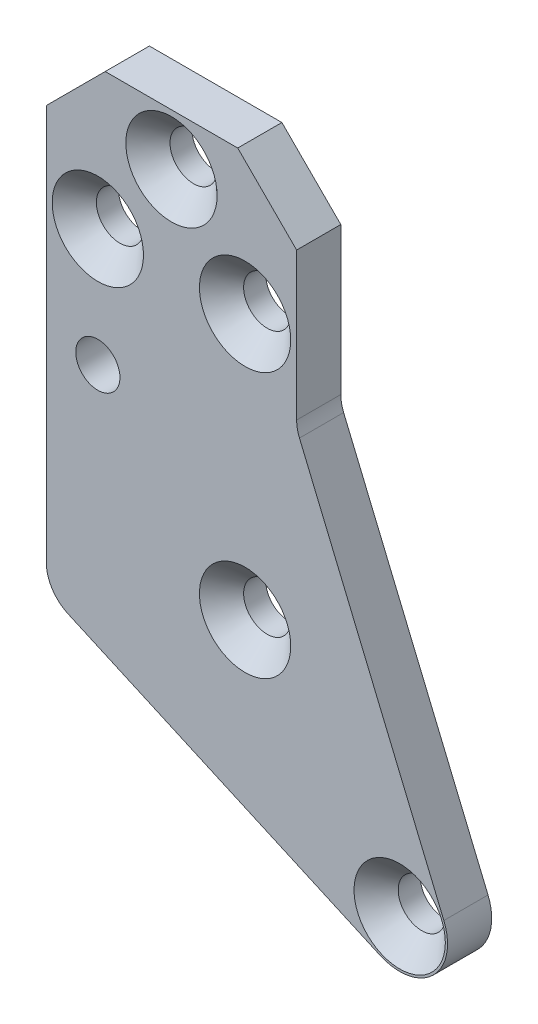
ISO-10303-21;
HEADER;
FILE_DESCRIPTION(('STEP AP214'),'2;1');
FILE_NAME('part.step','',(''),(''),'','','');
FILE_SCHEMA(('AUTOMOTIVE_DESIGN { 1 0 10303 214 1 1 1 1 }'));
ENDSEC;
DATA;
#1=APPLICATION_CONTEXT('core data for automotive mechanical design processes');
#2=APPLICATION_PROTOCOL_DEFINITION('international standard','automotive_design',2000,#1);
#3=PRODUCT_CONTEXT('',#1,'mechanical');
#4=PRODUCT('Part','Part','',(#3));
#5=PRODUCT_RELATED_PRODUCT_CATEGORY('part','',(#4));
#6=PRODUCT_DEFINITION_FORMATION('','',#4);
#7=PRODUCT_DEFINITION_CONTEXT('part definition',#1,'design');
#8=PRODUCT_DEFINITION('design','',#6,#7);
#9=PRODUCT_DEFINITION_SHAPE('','',#8);
#10=(LENGTH_UNIT() NAMED_UNIT(*) SI_UNIT(.MILLI.,.METRE.));
#11=(NAMED_UNIT(*) PLANE_ANGLE_UNIT() SI_UNIT($,.RADIAN.));
#12=(NAMED_UNIT(*) SI_UNIT($,.STERADIAN.) SOLID_ANGLE_UNIT());
#13=UNCERTAINTY_MEASURE_WITH_UNIT(LENGTH_MEASURE(1.E-05),#10,'distance_accuracy_value','');
#14=(GEOMETRIC_REPRESENTATION_CONTEXT(3) GLOBAL_UNCERTAINTY_ASSIGNED_CONTEXT((#13)) GLOBAL_UNIT_ASSIGNED_CONTEXT((#10,
#11,#12)) REPRESENTATION_CONTEXT('',''));
#15=CARTESIAN_POINT('',(0.,0.,0.));
#16=DIRECTION('',(0.,0.,1.));
#17=DIRECTION('',(1.,0.,0.));
#18=AXIS2_PLACEMENT_3D('',#15,#16,#17);
#19=CARTESIAN_POINT('',(20.5,-22.1865334794732,1.5));
#20=DIRECTION('',(0.,0.,1.));
#21=DIRECTION('',(1.,0.,0.));
#22=AXIS2_PLACEMENT_3D('',#19,#20,#21);
#23=PLANE('',#22);
#24=CARTESIAN_POINT('',(20.5,-22.1865334794732,1.5));
#25=DIRECTION('',(0.,0.,1.));
#26=DIRECTION('',(1.,0.,0.));
#27=AXIS2_PLACEMENT_3D('',#24,#25,#26);
#28=CIRCLE('',#27,3.10000000000002);
#29=CARTESIAN_POINT('',(23.6000000000001,-22.1865334794732,1.5));
#30=VERTEX_POINT('',#29);
#31=EDGE_CURVE('E181',#30,#30,#28,.F.);
#32=ORIENTED_EDGE('',*,*,#31,.T.);
#33=EDGE_LOOP('',(#32));
#34=FACE_BOUND('',#33,.T.);
#35=CARTESIAN_POINT('',(10.,-10.,1.5));
#36=DIRECTION('',(0.,0.,1.));
#37=DIRECTION('',(1.,0.,0.));
#38=AXIS2_PLACEMENT_3D('',#35,#36,#37);
#39=CIRCLE('',#38,3.10000000000002);
#40=CARTESIAN_POINT('',(13.1,-10.,1.5));
#41=VERTEX_POINT('',#40);
#42=EDGE_CURVE('E178',#41,#41,#39,.F.);
#43=ORIENTED_EDGE('',*,*,#42,.T.);
#44=EDGE_LOOP('',(#43));
#45=FACE_BOUND('',#44,.T.);
#46=CARTESIAN_POINT('',(10.,8.,1.5));
#47=DIRECTION('',(0.,0.,1.));
#48=DIRECTION('',(1.,0.,0.));
#49=AXIS2_PLACEMENT_3D('',#46,#47,#48);
#50=CIRCLE('',#49,3.10000000000002);
#51=CARTESIAN_POINT('',(13.1,8.,1.5));
#52=VERTEX_POINT('',#51);
#53=EDGE_CURVE('E175',#52,#52,#50,.F.);
#54=ORIENTED_EDGE('',*,*,#53,.T.);
#55=EDGE_LOOP('',(#54));
#56=FACE_BOUND('',#55,.T.);
#57=CARTESIAN_POINT('',(5.,14.,1.5));
#58=DIRECTION('',(0.,0.,1.));
#59=DIRECTION('',(1.,0.,0.));
#60=AXIS2_PLACEMENT_3D('',#57,#58,#59);
#61=CIRCLE('',#60,3.1);
#62=CARTESIAN_POINT('',(8.1,14.,1.5));
#63=VERTEX_POINT('',#62);
#64=EDGE_CURVE('E172',#63,#63,#61,.F.);
#65=ORIENTED_EDGE('',*,*,#64,.T.);
#66=EDGE_LOOP('',(#65));
#67=FACE_BOUND('',#66,.T.);
#68=CARTESIAN_POINT('',(0.,8.,1.5));
#69=DIRECTION('',(0.,0.,1.));
#70=DIRECTION('',(1.,0.,0.));
#71=AXIS2_PLACEMENT_3D('',#68,#69,#70);
#72=CIRCLE('',#71,3.10000000000002);
#73=CARTESIAN_POINT('',(3.10000000000002,8.,1.5));
#74=VERTEX_POINT('',#73);
#75=EDGE_CURVE('E169',#74,#74,#72,.F.);
#76=ORIENTED_EDGE('',*,*,#75,.T.);
#77=EDGE_LOOP('',(#76));
#78=FACE_BOUND('',#77,.T.);
#79=CARTESIAN_POINT('',(0.,0.,1.5));
#80=DIRECTION('',(0.,0.,1.));
#81=DIRECTION('',(1.,0.,0.));
#82=AXIS2_PLACEMENT_3D('',#79,#80,#81);
#83=CIRCLE('',#82,1.5);
#84=CARTESIAN_POINT('',(1.5,0.,1.5));
#85=VERTEX_POINT('',#84);
#86=EDGE_CURVE('E155',#85,#85,#83,.T.);
#87=ORIENTED_EDGE('',*,*,#86,.F.);
#88=EDGE_LOOP('',(#87));
#89=FACE_BOUND('',#88,.T.);
#90=DIRECTION('',(0.,1.,0.));
#91=VECTOR('',#90,1.);
#92=CARTESIAN_POINT('',(13.5,17.5,1.5));
#93=LINE('',#92,#91);
#94=CARTESIAN_POINT('',(13.5,3.50122345330613,1.5));
#95=VERTEX_POINT('',#94);
#96=CARTESIAN_POINT('',(13.5,13.5,1.5));
#97=VERTEX_POINT('',#96);
#98=EDGE_CURVE('E146',#95,#97,#93,.T.);
#99=ORIENTED_EDGE('',*,*,#98,.T.);
#100=DIRECTION('',(0.707106781186546,-0.707106781186549,0.));
#101=VECTOR('',#100,1.);
#102=CARTESIAN_POINT('',(34.8432667397366,-7.84326673973672,1.5));
#103=LINE('',#102,#101);
#104=CARTESIAN_POINT('',(9.49999999999999,17.5,1.5));
#105=VERTEX_POINT('',#104);
#106=EDGE_CURVE('E48',#97,#105,#103,.F.);
#107=ORIENTED_EDGE('',*,*,#106,.T.);
#108=DIRECTION('',(-1.,0.,0.));
#109=VECTOR('',#108,1.);
#110=CARTESIAN_POINT('',(-3.5,17.5,1.5));
#111=LINE('',#110,#109);
#112=CARTESIAN_POINT('',(0.500000000000015,17.5,1.5));
#113=VERTEX_POINT('',#112);
#114=EDGE_CURVE('E165',#105,#113,#111,.T.);
#115=ORIENTED_EDGE('',*,*,#114,.T.);
#116=DIRECTION('',(0.707106781186549,0.707106781186546,0.));
#117=VECTOR('',#116,1.);
#118=CARTESIAN_POINT('',(-9.34326673973654,7.65673326026348,1.5));
#119=LINE('',#118,#117);
#120=CARTESIAN_POINT('',(-3.5,13.5,1.5));
#121=VERTEX_POINT('',#120);
#122=EDGE_CURVE('E55',#113,#121,#119,.F.);
#123=ORIENTED_EDGE('',*,*,#122,.T.);
#124=DIRECTION('',(0.,-1.,0.));
#125=VECTOR('',#124,1.);
#126=CARTESIAN_POINT('',(-3.5,17.5,1.5));
#127=LINE('',#126,#125);
#128=CARTESIAN_POINT('',(-3.5,-13.3803085087297,1.5));
#129=VERTEX_POINT('',#128);
#130=EDGE_CURVE('E129',#121,#129,#127,.T.);
#131=ORIENTED_EDGE('',*,*,#130,.T.);
#132=CARTESIAN_POINT('',(-0.999999999999999,-13.3803085087297,1.5));
#133=DIRECTION('',(0.,0.,1.));
#134=DIRECTION('',(1.,0.,0.));
#135=AXIS2_PLACEMENT_3D('',#132,#133,#134);
#136=CIRCLE('',#135,2.5);
#137=CARTESIAN_POINT('',(-2.02176146059093,-15.6619753375308,1.5));
#138=VERTEX_POINT('',#137);
#139=EDGE_CURVE('E125',#129,#138,#136,.T.);
#140=ORIENTED_EDGE('',*,*,#139,.T.);
#141=DIRECTION('',(0.912666731520425,-0.408704584236371,0.));
#142=VECTOR('',#141,1.);
#143=CARTESIAN_POINT('',(-3.5,-15.,1.5));
#144=LINE('',#143,#142);
#145=CARTESIAN_POINT('',(19.1717101012318,-25.1527003569146,1.5));
#146=VERTEX_POINT('',#145);
#147=EDGE_CURVE('E118',#138,#146,#144,.T.);
#148=ORIENTED_EDGE('',*,*,#147,.T.);
#149=CARTESIAN_POINT('',(20.5,-22.1865334794732,1.5));
#150=DIRECTION('',(0.,0.,1.));
#151=DIRECTION('',(1.,0.,0.));
#152=AXIS2_PLACEMENT_3D('',#149,#150,#151);
#153=CIRCLE('',#152,3.25);
#154=CARTESIAN_POINT('',(23.498822385249,-20.9337109454607,1.5));
#155=VERTEX_POINT('',#154);
#156=EDGE_CURVE('E122',#146,#155,#153,.T.);
#157=ORIENTED_EDGE('',*,*,#156,.T.);
#158=DIRECTION('',(-0.385483856619218,0.922714580076621,0.));
#159=VECTOR('',#158,1.);
#160=CARTESIAN_POINT('',(13.5,3.,1.5));
#161=LINE('',#160,#159);
#162=CARTESIAN_POINT('',(13.6932135498084,2.53751381175808,1.5));
#163=VERTEX_POINT('',#162);
#164=EDGE_CURVE('E144',#155,#163,#161,.T.);
#165=ORIENTED_EDGE('',*,*,#164,.T.);
#166=CARTESIAN_POINT('',(16.,3.50122345330613,1.5));
#167=DIRECTION('',(0.,0.,1.));
#168=DIRECTION('',(1.,0.,0.));
#169=AXIS2_PLACEMENT_3D('',#166,#167,#168);
#170=CIRCLE('',#169,2.5);
#171=EDGE_CURVE('E212',#163,#95,#170,.F.);
#172=ORIENTED_EDGE('',*,*,#171,.T.);
#173=EDGE_LOOP('',(#99,#107,#115,#123,#131,#140,#148,#157,#165,#172));
#174=FACE_BOUND('',#173,.T.);
#175=ADVANCED_FACE('F39',(#34,#45,#56,#67,#78,#89,#174),#23,.T.);
#176=CARTESIAN_POINT('',(20.5,-22.1865334794732,-1.5));
#177=DIRECTION('',(0.,0.,1.));
#178=DIRECTION('',(1.,0.,0.));
#179=AXIS2_PLACEMENT_3D('',#176,#177,#178);
#180=PLANE('',#179);
#181=DIRECTION('',(-1.,0.,0.));
#182=VECTOR('',#181,1.);
#183=CARTESIAN_POINT('',(-3.5,17.5,-1.5));
#184=LINE('',#183,#182);
#185=CARTESIAN_POINT('',(9.49999999999999,17.5,-1.5));
#186=VERTEX_POINT('',#185);
#187=CARTESIAN_POINT('',(0.500000000000015,17.5,-1.5));
#188=VERTEX_POINT('',#187);
#189=EDGE_CURVE('E151',#186,#188,#184,.T.);
#190=ORIENTED_EDGE('',*,*,#189,.F.);
#191=DIRECTION('',(-0.707106781186546,0.707106781186549,0.));
#192=VECTOR('',#191,1.);
#193=CARTESIAN_POINT('',(9.49999999999999,17.5,-1.5));
#194=LINE('',#193,#192);
#195=CARTESIAN_POINT('',(13.5,13.5,-1.5));
#196=VERTEX_POINT('',#195);
#197=EDGE_CURVE('E221',#186,#196,#194,.F.);
#198=ORIENTED_EDGE('',*,*,#197,.T.);
#199=DIRECTION('',(0.,1.,0.));
#200=VECTOR('',#199,1.);
#201=CARTESIAN_POINT('',(13.5,17.5,-1.5));
#202=LINE('',#201,#200);
#203=CARTESIAN_POINT('',(13.5,3.50122345330613,-1.5));
#204=VERTEX_POINT('',#203);
#205=EDGE_CURVE('E163',#204,#196,#202,.T.);
#206=ORIENTED_EDGE('',*,*,#205,.F.);
#207=CARTESIAN_POINT('',(16.,3.50122345330613,-1.5));
#208=DIRECTION('',(0.,0.,1.));
#209=DIRECTION('',(1.,0.,0.));
#210=AXIS2_PLACEMENT_3D('',#207,#208,#209);
#211=CIRCLE('',#210,2.5);
#212=CARTESIAN_POINT('',(13.6932135498084,2.53751381175808,-1.5));
#213=VERTEX_POINT('',#212);
#214=EDGE_CURVE('E210',#204,#213,#211,.T.);
#215=ORIENTED_EDGE('',*,*,#214,.T.);
#216=DIRECTION('',(-0.385483856619218,0.922714580076621,0.));
#217=VECTOR('',#216,1.);
#218=CARTESIAN_POINT('',(13.5,3.,-1.5));
#219=LINE('',#218,#217);
#220=CARTESIAN_POINT('',(23.498822385249,-20.9337109454607,-1.5));
#221=VERTEX_POINT('',#220);
#222=EDGE_CURVE('E160',#221,#213,#219,.T.);
#223=ORIENTED_EDGE('',*,*,#222,.F.);
#224=CARTESIAN_POINT('',(20.5,-22.1865334794732,-1.5));
#225=DIRECTION('',(0.,0.,1.));
#226=DIRECTION('',(1.,0.,0.));
#227=AXIS2_PLACEMENT_3D('',#224,#225,#226);
#228=CIRCLE('',#227,3.25);
#229=CARTESIAN_POINT('',(19.1717101012318,-25.1527003569146,-1.5));
#230=VERTEX_POINT('',#229);
#231=EDGE_CURVE('E158',#230,#221,#228,.T.);
#232=ORIENTED_EDGE('',*,*,#231,.F.);
#233=DIRECTION('',(0.912666731520425,-0.408704584236371,0.));
#234=VECTOR('',#233,1.);
#235=CARTESIAN_POINT('',(-3.5,-15.,-1.5));
#236=LINE('',#235,#234);
#237=CARTESIAN_POINT('',(-2.02176146059093,-15.6619753375308,-1.5));
#238=VERTEX_POINT('',#237);
#239=EDGE_CURVE('E135',#238,#230,#236,.T.);
#240=ORIENTED_EDGE('',*,*,#239,.F.);
#241=CARTESIAN_POINT('',(-0.999999999999999,-13.3803085087297,-1.5));
#242=DIRECTION('',(0.,0.,1.));
#243=DIRECTION('',(1.,0.,0.));
#244=AXIS2_PLACEMENT_3D('',#241,#242,#243);
#245=CIRCLE('',#244,2.5);
#246=CARTESIAN_POINT('',(-3.5,-13.3803085087297,-1.5));
#247=VERTEX_POINT('',#246);
#248=EDGE_CURVE('E203',#238,#247,#245,.F.);
#249=ORIENTED_EDGE('',*,*,#248,.T.);
#250=DIRECTION('',(0.,-1.,0.));
#251=VECTOR('',#250,1.);
#252=CARTESIAN_POINT('',(-3.5,17.5,-1.5));
#253=LINE('',#252,#251);
#254=CARTESIAN_POINT('',(-3.5,13.5,-1.5));
#255=VERTEX_POINT('',#254);
#256=EDGE_CURVE('E154',#255,#247,#253,.T.);
#257=ORIENTED_EDGE('',*,*,#256,.F.);
#258=DIRECTION('',(-0.707106781186549,-0.707106781186546,0.));
#259=VECTOR('',#258,1.);
#260=CARTESIAN_POINT('',(-3.5,13.5,-1.5));
#261=LINE('',#260,#259);
#262=EDGE_CURVE('E219',#255,#188,#261,.F.);
#263=ORIENTED_EDGE('',*,*,#262,.T.);
#264=EDGE_LOOP('',(#190,#198,#206,#215,#223,#232,#240,#249,#257,#263));
#265=FACE_BOUND('',#264,.T.);
#266=CARTESIAN_POINT('',(0.,0.,-1.5));
#267=DIRECTION('',(0.,0.,1.));
#268=DIRECTION('',(1.,0.,0.));
#269=AXIS2_PLACEMENT_3D('',#266,#267,#268);
#270=CIRCLE('',#269,1.5);
#271=CARTESIAN_POINT('',(1.5,0.,-1.5));
#272=VERTEX_POINT('',#271);
#273=EDGE_CURVE('E314',#272,#272,#270,.T.);
#274=ORIENTED_EDGE('',*,*,#273,.T.);
#275=EDGE_LOOP('',(#274));
#276=FACE_BOUND('',#275,.T.);
#277=CARTESIAN_POINT('',(10.,-10.,-1.5));
#278=DIRECTION('',(0.,0.,1.));
#279=DIRECTION('',(1.,0.,0.));
#280=AXIS2_PLACEMENT_3D('',#277,#278,#279);
#281=CIRCLE('',#280,1.6);
#282=CARTESIAN_POINT('',(11.6,-10.,-1.5));
#283=VERTEX_POINT('',#282);
#284=EDGE_CURVE('E311',#283,#283,#281,.T.);
#285=ORIENTED_EDGE('',*,*,#284,.T.);
#286=EDGE_LOOP('',(#285));
#287=FACE_BOUND('',#286,.T.);
#288=CARTESIAN_POINT('',(20.5,-22.1865334794732,-1.5));
#289=DIRECTION('',(0.,0.,1.));
#290=DIRECTION('',(1.,0.,0.));
#291=AXIS2_PLACEMENT_3D('',#288,#289,#290);
#292=CIRCLE('',#291,1.6);
#293=CARTESIAN_POINT('',(22.1,-22.1865334794732,-1.5));
#294=VERTEX_POINT('',#293);
#295=EDGE_CURVE('E308',#294,#294,#292,.T.);
#296=ORIENTED_EDGE('',*,*,#295,.T.);
#297=EDGE_LOOP('',(#296));
#298=FACE_BOUND('',#297,.T.);
#299=CARTESIAN_POINT('',(0.,8.,-1.5));
#300=DIRECTION('',(0.,0.,1.));
#301=DIRECTION('',(1.,0.,0.));
#302=AXIS2_PLACEMENT_3D('',#299,#300,#301);
#303=CIRCLE('',#302,1.6);
#304=CARTESIAN_POINT('',(1.6,8.,-1.5));
#305=VERTEX_POINT('',#304);
#306=EDGE_CURVE('E303',#305,#305,#303,.T.);
#307=ORIENTED_EDGE('',*,*,#306,.T.);
#308=EDGE_LOOP('',(#307));
#309=FACE_BOUND('',#308,.T.);
#310=CARTESIAN_POINT('',(10.,8.,-1.5));
#311=DIRECTION('',(0.,0.,1.));
#312=DIRECTION('',(1.,0.,0.));
#313=AXIS2_PLACEMENT_3D('',#310,#311,#312);
#314=CIRCLE('',#313,1.6);
#315=CARTESIAN_POINT('',(11.6,8.,-1.5));
#316=VERTEX_POINT('',#315);
#317=EDGE_CURVE('E300',#316,#316,#314,.T.);
#318=ORIENTED_EDGE('',*,*,#317,.T.);
#319=EDGE_LOOP('',(#318));
#320=FACE_BOUND('',#319,.T.);
#321=CARTESIAN_POINT('',(5.,14.,-1.5));
#322=DIRECTION('',(0.,0.,1.));
#323=DIRECTION('',(1.,0.,0.));
#324=AXIS2_PLACEMENT_3D('',#321,#322,#323);
#325=CIRCLE('',#324,1.6);
#326=CARTESIAN_POINT('',(6.6,14.,-1.5));
#327=VERTEX_POINT('',#326);
#328=EDGE_CURVE('E298',#327,#327,#325,.T.);
#329=ORIENTED_EDGE('',*,*,#328,.T.);
#330=EDGE_LOOP('',(#329));
#331=FACE_BOUND('',#330,.T.);
#332=ADVANCED_FACE('F236',(#265,#276,#287,#298,#309,#320,#331),#180,.F.);
#333=CARTESIAN_POINT('',(-3.5,17.5,1.5));
#334=DIRECTION('',(0.,-1.,0.));
#335=DIRECTION('',(0.,0.,-1.));
#336=AXIS2_PLACEMENT_3D('',#333,#334,#335);
#337=PLANE('',#336);
#338=ORIENTED_EDGE('',*,*,#114,.F.);
#339=DIRECTION('',(0.,0.,-1.));
#340=VECTOR('',#339,1.);
#341=CARTESIAN_POINT('',(9.49999999999999,17.5,1.5));
#342=LINE('',#341,#340);
#343=EDGE_CURVE('E216',#105,#186,#342,.T.);
#344=ORIENTED_EDGE('',*,*,#343,.T.);
#345=ORIENTED_EDGE('',*,*,#189,.T.);
#346=DIRECTION('',(0.,0.,1.));
#347=VECTOR('',#346,1.);
#348=CARTESIAN_POINT('',(0.500000000000015,17.5,1.5));
#349=LINE('',#348,#347);
#350=EDGE_CURVE('E214',#188,#113,#349,.T.);
#351=ORIENTED_EDGE('',*,*,#350,.T.);
#352=EDGE_LOOP('',(#338,#344,#345,#351));
#353=FACE_BOUND('',#352,.T.);
#354=ADVANCED_FACE('F229',(#353),#337,.F.);
#355=CARTESIAN_POINT('',(-3.5,17.5,1.5));
#356=DIRECTION('',(1.,0.,0.));
#357=DIRECTION('',(0.,1.,0.));
#358=AXIS2_PLACEMENT_3D('',#355,#356,#357);
#359=PLANE('',#358);
#360=ORIENTED_EDGE('',*,*,#130,.F.);
#361=DIRECTION('',(0.,0.,-1.));
#362=VECTOR('',#361,1.);
#363=CARTESIAN_POINT('',(-3.5,13.5,1.5));
#364=LINE('',#363,#362);
#365=EDGE_CURVE('E11',#121,#255,#364,.T.);
#366=ORIENTED_EDGE('',*,*,#365,.T.);
#367=ORIENTED_EDGE('',*,*,#256,.T.);
#368=DIRECTION('',(0.,0.,-1.));
#369=VECTOR('',#368,1.);
#370=CARTESIAN_POINT('',(-3.5,-13.3803085087297,1.5));
#371=LINE('',#370,#369);
#372=EDGE_CURVE('E206',#247,#129,#371,.F.);
#373=ORIENTED_EDGE('',*,*,#372,.T.);
#374=EDGE_LOOP('',(#360,#366,#367,#373));
#375=FACE_BOUND('',#374,.T.);
#376=ADVANCED_FACE('F321',(#375),#359,.F.);
#377=CARTESIAN_POINT('',(-3.5,-15.,1.5));
#378=DIRECTION('',(0.408704584236371,0.912666731520425,0.));
#379=DIRECTION('',(-0.912666731520425,0.408704584236371,0.));
#380=AXIS2_PLACEMENT_3D('',#377,#378,#379);
#381=PLANE('',#380);
#382=ORIENTED_EDGE('',*,*,#147,.F.);
#383=DIRECTION('',(0.,0.,-1.));
#384=VECTOR('',#383,1.);
#385=CARTESIAN_POINT('',(-2.02176146059092,-15.6619753375308,1.5));
#386=LINE('',#385,#384);
#387=EDGE_CURVE('E201',#138,#238,#386,.T.);
#388=ORIENTED_EDGE('',*,*,#387,.T.);
#389=ORIENTED_EDGE('',*,*,#239,.T.);
#390=DIRECTION('',(0.,0.,-1.));
#391=VECTOR('',#390,1.);
#392=CARTESIAN_POINT('',(19.1717101012318,-25.1527003569146,1.5));
#393=LINE('',#392,#391);
#394=EDGE_CURVE('E132',#146,#230,#393,.T.);
#395=ORIENTED_EDGE('',*,*,#394,.F.);
#396=EDGE_LOOP('',(#382,#388,#389,#395));
#397=FACE_BOUND('',#396,.T.);
#398=ADVANCED_FACE('F133',(#397),#381,.F.);
#399=CARTESIAN_POINT('',(20.5,-22.1865334794732,1.5));
#400=DIRECTION('',(0.,0.,-1.));
#401=DIRECTION('',(-1.,0.,0.));
#402=AXIS2_PLACEMENT_3D('',#399,#400,#401);
#403=CYLINDRICAL_SURFACE('',#402,3.25);
#404=ORIENTED_EDGE('',*,*,#231,.T.);
#405=DIRECTION('',(0.,0.,-1.));
#406=VECTOR('',#405,1.);
#407=CARTESIAN_POINT('',(23.498822385249,-20.9337109454607,1.5));
#408=LINE('',#407,#406);
#409=EDGE_CURVE('E139',#155,#221,#408,.T.);
#410=ORIENTED_EDGE('',*,*,#409,.F.);
#411=ORIENTED_EDGE('',*,*,#156,.F.);
#412=ORIENTED_EDGE('',*,*,#394,.T.);
#413=EDGE_LOOP('',(#404,#410,#411,#412));
#414=FACE_BOUND('',#413,.T.);
#415=ADVANCED_FACE('F141',(#414),#403,.T.);
#416=CARTESIAN_POINT('',(13.5,3.,1.5));
#417=DIRECTION('',(-0.922714580076621,-0.385483856619218,0.));
#418=DIRECTION('',(0.385483856619218,-0.922714580076621,0.));
#419=AXIS2_PLACEMENT_3D('',#416,#417,#418);
#420=PLANE('',#419);
#421=ORIENTED_EDGE('',*,*,#222,.T.);
#422=DIRECTION('',(0.,0.,-1.));
#423=VECTOR('',#422,1.);
#424=CARTESIAN_POINT('',(13.6932135498084,2.53751381175808,1.5));
#425=LINE('',#424,#423);
#426=EDGE_CURVE('E199',#213,#163,#425,.F.);
#427=ORIENTED_EDGE('',*,*,#426,.T.);
#428=ORIENTED_EDGE('',*,*,#164,.F.);
#429=ORIENTED_EDGE('',*,*,#409,.T.);
#430=EDGE_LOOP('',(#421,#427,#428,#429));
#431=FACE_BOUND('',#430,.T.);
#432=ADVANCED_FACE('F246',(#431),#420,.F.);
#433=CARTESIAN_POINT('',(13.5,17.5,1.5));
#434=DIRECTION('',(-1.,0.,0.));
#435=DIRECTION('',(0.,-1.,0.));
#436=AXIS2_PLACEMENT_3D('',#433,#434,#435);
#437=PLANE('',#436);
#438=ORIENTED_EDGE('',*,*,#205,.T.);
#439=DIRECTION('',(0.,0.,1.));
#440=VECTOR('',#439,1.);
#441=CARTESIAN_POINT('',(13.5,13.5,1.5));
#442=LINE('',#441,#440);
#443=EDGE_CURVE('E63',#196,#97,#442,.T.);
#444=ORIENTED_EDGE('',*,*,#443,.T.);
#445=ORIENTED_EDGE('',*,*,#98,.F.);
#446=DIRECTION('',(0.,0.,-1.));
#447=VECTOR('',#446,1.);
#448=CARTESIAN_POINT('',(13.5,3.50122345330613,-1.5));
#449=LINE('',#448,#447);
#450=EDGE_CURVE('E196',#95,#204,#449,.T.);
#451=ORIENTED_EDGE('',*,*,#450,.T.);
#452=EDGE_LOOP('',(#438,#444,#445,#451));
#453=FACE_BOUND('',#452,.T.);
#454=ADVANCED_FACE('F238',(#453),#437,.F.);
#455=CARTESIAN_POINT('',(0.,0.,1.5));
#456=DIRECTION('',(0.,0.,-1.));
#457=DIRECTION('',(-1.,0.,0.));
#458=AXIS2_PLACEMENT_3D('',#455,#456,#457);
#459=CYLINDRICAL_SURFACE('',#458,1.5);
#460=ORIENTED_EDGE('',*,*,#86,.T.);
#461=EDGE_LOOP('',(#460));
#462=FACE_BOUND('',#461,.T.);
#463=ORIENTED_EDGE('',*,*,#273,.F.);
#464=EDGE_LOOP('',(#463));
#465=FACE_BOUND('',#464,.T.);
#466=ADVANCED_FACE('F253',(#462,#465),#459,.F.);
#467=CARTESIAN_POINT('',(10.,-10.,1.5));
#468=DIRECTION('',(0.,0.,-1.));
#469=DIRECTION('',(-1.,0.,0.));
#470=AXIS2_PLACEMENT_3D('',#467,#468,#469);
#471=CYLINDRICAL_SURFACE('',#470,1.6);
#472=CARTESIAN_POINT('',(10.,-10.,0.));
#473=DIRECTION('',(0.,0.,1.));
#474=DIRECTION('',(1.,0.,0.));
#475=AXIS2_PLACEMENT_3D('',#472,#473,#474);
#476=CIRCLE('',#475,1.6);
#477=CARTESIAN_POINT('',(11.6,-10.,0.));
#478=VERTEX_POINT('',#477);
#479=EDGE_CURVE('E184',#478,#478,#476,.T.);
#480=ORIENTED_EDGE('',*,*,#479,.T.);
#481=EDGE_LOOP('',(#480));
#482=FACE_BOUND('',#481,.T.);
#483=ORIENTED_EDGE('',*,*,#284,.F.);
#484=EDGE_LOOP('',(#483));
#485=FACE_BOUND('',#484,.T.);
#486=ADVANCED_FACE('F267',(#482,#485),#471,.F.);
#487=CARTESIAN_POINT('',(20.5,-22.1865334794732,1.5));
#488=DIRECTION('',(0.,0.,-1.));
#489=DIRECTION('',(-1.,0.,0.));
#490=AXIS2_PLACEMENT_3D('',#487,#488,#489);
#491=CYLINDRICAL_SURFACE('',#490,1.6);
#492=CARTESIAN_POINT('',(20.5,-22.1865334794732,0.));
#493=DIRECTION('',(0.,0.,1.));
#494=DIRECTION('',(1.,0.,0.));
#495=AXIS2_PLACEMENT_3D('',#492,#493,#494);
#496=CIRCLE('',#495,1.6);
#497=CARTESIAN_POINT('',(22.1,-22.1865334794732,0.));
#498=VERTEX_POINT('',#497);
#499=EDGE_CURVE('E138',#498,#498,#496,.T.);
#500=ORIENTED_EDGE('',*,*,#499,.T.);
#501=EDGE_LOOP('',(#500));
#502=FACE_BOUND('',#501,.T.);
#503=ORIENTED_EDGE('',*,*,#295,.F.);
#504=EDGE_LOOP('',(#503));
#505=FACE_BOUND('',#504,.T.);
#506=ADVANCED_FACE('F271',(#502,#505),#491,.F.);
#507=CARTESIAN_POINT('',(0.,8.,1.5));
#508=DIRECTION('',(0.,0.,-1.));
#509=DIRECTION('',(-1.,0.,0.));
#510=AXIS2_PLACEMENT_3D('',#507,#508,#509);
#511=CYLINDRICAL_SURFACE('',#510,1.6);
#512=CARTESIAN_POINT('',(0.,8.,0.));
#513=DIRECTION('',(0.,0.,1.));
#514=DIRECTION('',(1.,0.,0.));
#515=AXIS2_PLACEMENT_3D('',#512,#513,#514);
#516=CIRCLE('',#515,1.6);
#517=CARTESIAN_POINT('',(1.6,8.,0.));
#518=VERTEX_POINT('',#517);
#519=EDGE_CURVE('E193',#518,#518,#516,.T.);
#520=ORIENTED_EDGE('',*,*,#519,.T.);
#521=EDGE_LOOP('',(#520));
#522=FACE_BOUND('',#521,.T.);
#523=ORIENTED_EDGE('',*,*,#306,.F.);
#524=EDGE_LOOP('',(#523));
#525=FACE_BOUND('',#524,.T.);
#526=ADVANCED_FACE('F275',(#522,#525),#511,.F.);
#527=CARTESIAN_POINT('',(10.,8.,1.5));
#528=DIRECTION('',(0.,0.,-1.));
#529=DIRECTION('',(-1.,0.,0.));
#530=AXIS2_PLACEMENT_3D('',#527,#528,#529);
#531=CYLINDRICAL_SURFACE('',#530,1.6);
#532=CARTESIAN_POINT('',(10.,8.,0.));
#533=DIRECTION('',(0.,0.,1.));
#534=DIRECTION('',(1.,0.,0.));
#535=AXIS2_PLACEMENT_3D('',#532,#533,#534);
#536=CIRCLE('',#535,1.6);
#537=CARTESIAN_POINT('',(11.6,8.,0.));
#538=VERTEX_POINT('',#537);
#539=EDGE_CURVE('E187',#538,#538,#536,.T.);
#540=ORIENTED_EDGE('',*,*,#539,.T.);
#541=EDGE_LOOP('',(#540));
#542=FACE_BOUND('',#541,.T.);
#543=ORIENTED_EDGE('',*,*,#317,.F.);
#544=EDGE_LOOP('',(#543));
#545=FACE_BOUND('',#544,.T.);
#546=ADVANCED_FACE('F279',(#542,#545),#531,.F.);
#547=CARTESIAN_POINT('',(5.,14.,1.5));
#548=DIRECTION('',(0.,0.,-1.));
#549=DIRECTION('',(-1.,0.,0.));
#550=AXIS2_PLACEMENT_3D('',#547,#548,#549);
#551=CYLINDRICAL_SURFACE('',#550,1.6);
#552=CARTESIAN_POINT('',(5.,14.,0.));
#553=DIRECTION('',(0.,0.,1.));
#554=DIRECTION('',(1.,0.,0.));
#555=AXIS2_PLACEMENT_3D('',#552,#553,#554);
#556=CIRCLE('',#555,1.6);
#557=CARTESIAN_POINT('',(6.6,14.,0.));
#558=VERTEX_POINT('',#557);
#559=EDGE_CURVE('E190',#558,#558,#556,.T.);
#560=ORIENTED_EDGE('',*,*,#559,.T.);
#561=EDGE_LOOP('',(#560));
#562=FACE_BOUND('',#561,.T.);
#563=ORIENTED_EDGE('',*,*,#328,.F.);
#564=EDGE_LOOP('',(#563));
#565=FACE_BOUND('',#564,.T.);
#566=ADVANCED_FACE('F283',(#562,#565),#551,.F.);
#567=CARTESIAN_POINT('',(20.5,-22.1865334794732,0.));
#568=DIRECTION('',(0.,0.,1.));
#569=DIRECTION('',(1.,0.,0.));
#570=AXIS2_PLACEMENT_3D('',#567,#568,#569);
#571=CONICAL_SURFACE('',#570,1.6,0.785398163397449);
#572=CARTESIAN_POINT('',(23.6000000000001,-22.1865334794732,1.5));
#573=CARTESIAN_POINT('',(23.5843750000001,-22.1865334794732,1.484375));
#574=CARTESIAN_POINT('',(23.56875,-22.1865334794732,1.46875));
#575=CARTESIAN_POINT('',(23.5375000000001,-22.1865334794732,1.4375));
#576=CARTESIAN_POINT('',(23.5218750000001,-22.1865334794732,1.421875));
#577=CARTESIAN_POINT('',(23.4906250000001,-22.1865334794732,1.390625));
#578=CARTESIAN_POINT('',(23.4750000000001,-22.1865334794732,1.375));
#579=CARTESIAN_POINT('',(23.4437500000001,-22.1865334794732,1.34375));
#580=CARTESIAN_POINT('',(23.4281250000001,-22.1865334794732,1.328125));
#581=CARTESIAN_POINT('',(23.3968750000001,-22.1865334794732,1.296875));
#582=CARTESIAN_POINT('',(23.3812500000001,-22.1865334794732,1.28125));
#583=CARTESIAN_POINT('',(23.35,-22.1865334794732,1.25));
#584=CARTESIAN_POINT('',(23.3343750000001,-22.1865334794732,1.234375));
#585=CARTESIAN_POINT('',(23.3031250000001,-22.1865334794732,1.203125));
#586=CARTESIAN_POINT('',(23.2875,-22.1865334794732,1.1875));
#587=CARTESIAN_POINT('',(23.25625,-22.1865334794732,1.15625));
#588=CARTESIAN_POINT('',(23.2406250000001,-22.1865334794732,1.140625));
#589=CARTESIAN_POINT('',(23.2093750000001,-22.1865334794732,1.109375));
#590=CARTESIAN_POINT('',(23.19375,-22.1865334794732,1.09375));
#591=CARTESIAN_POINT('',(23.1625,-22.1865334794732,1.0625));
#592=CARTESIAN_POINT('',(23.146875,-22.1865334794732,1.046875));
#593=CARTESIAN_POINT('',(23.115625,-22.1865334794732,1.015625));
#594=CARTESIAN_POINT('',(23.1,-22.1865334794732,0.999999999999996));
#595=CARTESIAN_POINT('',(23.06875,-22.1865334794732,0.968749999999996));
#596=CARTESIAN_POINT('',(23.053125,-22.1865334794732,0.953124999999995));
#597=CARTESIAN_POINT('',(23.021875,-22.1865334794732,0.921874999999995));
#598=CARTESIAN_POINT('',(23.00625,-22.1865334794732,0.906249999999995));
#599=CARTESIAN_POINT('',(22.975,-22.1865334794732,0.874999999999995));
#600=CARTESIAN_POINT('',(22.959375,-22.1865334794732,0.859374999999995));
#601=CARTESIAN_POINT('',(22.928125,-22.1865334794732,0.828124999999994));
#602=CARTESIAN_POINT('',(22.9125,-22.1865334794732,0.812499999999994));
#603=CARTESIAN_POINT('',(22.88125,-22.1865334794732,0.781249999999993));
#604=CARTESIAN_POINT('',(22.865625,-22.1865334794732,0.765624999999993));
#605=CARTESIAN_POINT('',(22.834375,-22.1865334794732,0.734374999999993));
#606=CARTESIAN_POINT('',(22.81875,-22.1865334794732,0.718749999999994));
#607=CARTESIAN_POINT('',(22.7875,-22.1865334794732,0.687499999999993));
#608=CARTESIAN_POINT('',(22.771875,-22.1865334794732,0.671874999999992));
#609=CARTESIAN_POINT('',(22.740625,-22.1865334794732,0.640624999999992));
#610=CARTESIAN_POINT('',(22.725,-22.1865334794732,0.624999999999993));
#611=CARTESIAN_POINT('',(22.69375,-22.1865334794732,0.593749999999992));
#612=CARTESIAN_POINT('',(22.678125,-22.1865334794732,0.578124999999992));
#613=CARTESIAN_POINT('',(22.646875,-22.1865334794732,0.546874999999991));
#614=CARTESIAN_POINT('',(22.63125,-22.1865334794732,0.531249999999991));
#615=CARTESIAN_POINT('',(22.6,-22.1865334794732,0.499999999999992));
#616=CARTESIAN_POINT('',(22.584375,-22.1865334794732,0.484374999999992));
#617=CARTESIAN_POINT('',(22.553125,-22.1865334794732,0.453124999999991));
#618=CARTESIAN_POINT('',(22.5375,-22.1865334794732,0.43749999999999));
#619=CARTESIAN_POINT('',(22.50625,-22.1865334794732,0.40624999999999));
#620=CARTESIAN_POINT('',(22.490625,-22.1865334794732,0.390624999999991));
#621=CARTESIAN_POINT('',(22.459375,-22.1865334794732,0.359374999999991));
#622=CARTESIAN_POINT('',(22.44375,-22.1865334794732,0.34374999999999));
#623=CARTESIAN_POINT('',(22.4125,-22.1865334794732,0.312499999999989));
#624=CARTESIAN_POINT('',(22.396875,-22.1865334794732,0.296874999999989));
#625=CARTESIAN_POINT('',(22.365625,-22.1865334794732,0.265624999999989));
#626=CARTESIAN_POINT('',(22.35,-22.1865334794732,0.249999999999989));
#627=CARTESIAN_POINT('',(22.31875,-22.1865334794732,0.218749999999989));
#628=CARTESIAN_POINT('',(22.303125,-22.1865334794732,0.203124999999989));
#629=CARTESIAN_POINT('',(22.271875,-22.1865334794732,0.171874999999988));
#630=CARTESIAN_POINT('',(22.25625,-22.1865334794732,0.156249999999988));
#631=CARTESIAN_POINT('',(22.225,-22.1865334794732,0.124999999999988));
#632=CARTESIAN_POINT('',(22.209375,-22.1865334794732,0.109374999999988));
#633=CARTESIAN_POINT('',(22.178125,-22.1865334794732,0.0781249999999878));
#634=CARTESIAN_POINT('',(22.1625,-22.1865334794732,0.0624999999999875));
#635=CARTESIAN_POINT('',(22.13125,-22.1865334794732,0.0312499999999868));
#636=CARTESIAN_POINT('',(22.115625,-22.1865334794732,0.0156249999999864));
#637=CARTESIAN_POINT('',(22.1,-22.1865334794732,0.));
#638=B_SPLINE_CURVE_WITH_KNOTS('',3,(#572,#573,#574,#575,#576,#577,#578,#579,#580,#581,#582,
#583,#584,#585,#586,#587,#588,#589,#590,#591,#592,#593,#594,#595,#596,#597,#598,#599,#600,#601,
#602,#603,#604,#605,#606,#607,#608,#609,#610,#611,#612,#613,#614,#615,#616,#617,#618,#619,#620,
#621,#622,#623,#624,#625,#626,#627,#628,#629,#630,#631,#632,#633,#634,#635,#636,#637),
.UNSPECIFIED.,.F.,.F.,(4,2,2,2,2,2,2,2,2,2,2,2,2,2,2,2,2,2,2,2,2,2,2,2,2,2,2,2,2,2,2,2,4),(0.,
0.0662912607362404,0.132582521472478,0.198873782208719,0.265165042944957,0.331456303681197,
0.397747564417437,0.464038825153675,0.530330085889916,0.596621346626154,0.662912607362394,
0.729203868098634,0.795495128834872,0.861786389571113,0.928077650307353,0.994368911043591,
1.06066017177983,1.12695143251607,1.19324269325231,1.25953395398855,1.32582521472479,
1.39211647546103,1.45840773619727,1.52469899693351,1.59099025766975,1.65728151840598,
1.72357277914223,1.78986403987847,1.8561553006147,1.92244656135094,1.98873782208718,
2.05502908282342,2.12132034355966),.UNSPECIFIED.);
#639=EDGE_CURVE('BSEAM286',#30,#498,#638,.T.);
#640=ORIENTED_EDGE('',*,*,#31,.F.);
#641=ORIENTED_EDGE('',*,*,#499,.F.);
#642=ORIENTED_EDGE('',*,*,#639,.T.);
#643=ORIENTED_EDGE('',*,*,#639,.F.);
#644=EDGE_LOOP('',(#640,#642,#641,#643));
#645=FACE_BOUND('',#644,.T.);
#646=ADVANCED_FACE('F286',(#645),#571,.F.);
#647=CARTESIAN_POINT('',(10.,-10.,0.));
#648=DIRECTION('',(0.,0.,1.));
#649=DIRECTION('',(1.,0.,0.));
#650=AXIS2_PLACEMENT_3D('',#647,#648,#649);
#651=CONICAL_SURFACE('',#650,1.6,0.785398163397449);
#652=ORIENTED_EDGE('',*,*,#42,.F.);
#653=EDGE_LOOP('',(#652));
#654=FACE_BOUND('',#653,.T.);
#655=ORIENTED_EDGE('',*,*,#479,.F.);
#656=EDGE_LOOP('',(#655));
#657=FACE_BOUND('',#656,.T.);
#658=ADVANCED_FACE('F291',(#654,#657),#651,.F.);
#659=CARTESIAN_POINT('',(10.,8.,0.));
#660=DIRECTION('',(0.,0.,1.));
#661=DIRECTION('',(1.,0.,0.));
#662=AXIS2_PLACEMENT_3D('',#659,#660,#661);
#663=CONICAL_SURFACE('',#662,1.6,0.785398163397449);
#664=ORIENTED_EDGE('',*,*,#53,.F.);
#665=EDGE_LOOP('',(#664));
#666=FACE_BOUND('',#665,.T.);
#667=ORIENTED_EDGE('',*,*,#539,.F.);
#668=EDGE_LOOP('',(#667));
#669=FACE_BOUND('',#668,.T.);
#670=ADVANCED_FACE('F354',(#666,#669),#663,.F.);
#671=CARTESIAN_POINT('',(5.,14.,0.));
#672=DIRECTION('',(0.,0.,1.));
#673=DIRECTION('',(1.,0.,0.));
#674=AXIS2_PLACEMENT_3D('',#671,#672,#673);
#675=CONICAL_SURFACE('',#674,1.6,0.785398163397449);
#676=ORIENTED_EDGE('',*,*,#64,.F.);
#677=EDGE_LOOP('',(#676));
#678=FACE_BOUND('',#677,.T.);
#679=ORIENTED_EDGE('',*,*,#559,.F.);
#680=EDGE_LOOP('',(#679));
#681=FACE_BOUND('',#680,.T.);
#682=ADVANCED_FACE('F347',(#678,#681),#675,.F.);
#683=CARTESIAN_POINT('',(0.,8.,0.));
#684=DIRECTION('',(0.,0.,1.));
#685=DIRECTION('',(1.,0.,0.));
#686=AXIS2_PLACEMENT_3D('',#683,#684,#685);
#687=CONICAL_SURFACE('',#686,1.6,0.785398163397449);
#688=ORIENTED_EDGE('',*,*,#75,.F.);
#689=EDGE_LOOP('',(#688));
#690=FACE_BOUND('',#689,.T.);
#691=ORIENTED_EDGE('',*,*,#519,.F.);
#692=EDGE_LOOP('',(#691));
#693=FACE_BOUND('',#692,.T.);
#694=ADVANCED_FACE('F341',(#690,#693),#687,.F.);
#695=CARTESIAN_POINT('',(16.,3.50122345330613,1.5));
#696=DIRECTION('',(0.,0.,1.));
#697=DIRECTION('',(1.,0.,0.));
#698=AXIS2_PLACEMENT_3D('',#695,#696,#697);
#699=CYLINDRICAL_SURFACE('',#698,2.5);
#700=ORIENTED_EDGE('',*,*,#171,.F.);
#701=ORIENTED_EDGE('',*,*,#426,.F.);
#702=ORIENTED_EDGE('',*,*,#214,.F.);
#703=ORIENTED_EDGE('',*,*,#450,.F.);
#704=EDGE_LOOP('',(#700,#701,#702,#703));
#705=FACE_BOUND('',#704,.T.);
#706=ADVANCED_FACE('F242',(#705),#699,.F.);
#707=CARTESIAN_POINT('',(-0.999999999999999,-13.3803085087297,1.5));
#708=DIRECTION('',(0.,0.,-1.));
#709=DIRECTION('',(-1.,0.,0.));
#710=AXIS2_PLACEMENT_3D('',#707,#708,#709);
#711=CYLINDRICAL_SURFACE('',#710,2.5);
#712=ORIENTED_EDGE('',*,*,#139,.F.);
#713=ORIENTED_EDGE('',*,*,#372,.F.);
#714=ORIENTED_EDGE('',*,*,#248,.F.);
#715=ORIENTED_EDGE('',*,*,#387,.F.);
#716=EDGE_LOOP('',(#712,#713,#714,#715));
#717=FACE_BOUND('',#716,.T.);
#718=ADVANCED_FACE('F324',(#717),#711,.T.);
#719=CARTESIAN_POINT('',(9.49999999999999,17.5,1.5));
#720=DIRECTION('',(-0.707106781186549,-0.707106781186546,0.));
#721=DIRECTION('',(0.,0.,-1.));
#722=AXIS2_PLACEMENT_3D('',#719,#720,#721);
#723=PLANE('',#722);
#724=ORIENTED_EDGE('',*,*,#106,.F.);
#725=ORIENTED_EDGE('',*,*,#443,.F.);
#726=ORIENTED_EDGE('',*,*,#197,.F.);
#727=ORIENTED_EDGE('',*,*,#343,.F.);
#728=EDGE_LOOP('',(#724,#725,#726,#727));
#729=FACE_BOUND('',#728,.T.);
#730=ADVANCED_FACE('F233',(#729),#723,.F.);
#731=CARTESIAN_POINT('',(-3.5,13.5,1.5));
#732=DIRECTION('',(0.707106781186546,-0.707106781186549,0.));
#733=DIRECTION('',(0.,0.,-1.));
#734=AXIS2_PLACEMENT_3D('',#731,#732,#733);
#735=PLANE('',#734);
#736=ORIENTED_EDGE('',*,*,#122,.F.);
#737=ORIENTED_EDGE('',*,*,#350,.F.);
#738=ORIENTED_EDGE('',*,*,#262,.F.);
#739=ORIENTED_EDGE('',*,*,#365,.F.);
#740=EDGE_LOOP('',(#736,#737,#738,#739));
#741=FACE_BOUND('',#740,.T.);
#742=ADVANCED_FACE('F42',(#741),#735,.F.);
#743=CLOSED_SHELL('',(#175,#332,#354,#376,#398,#415,#432,#454,#466,#486,#506,#526,#546,#566,
#646,#658,#670,#682,#694,#706,#718,#730,#742));
#744=MANIFOLD_SOLID_BREP('B2',#743);
#745=ADVANCED_BREP_SHAPE_REPRESENTATION('',(#18,#744),#14);
#746=SHAPE_DEFINITION_REPRESENTATION(#9,#745);
ENDSEC;
END-ISO-10303-21;
